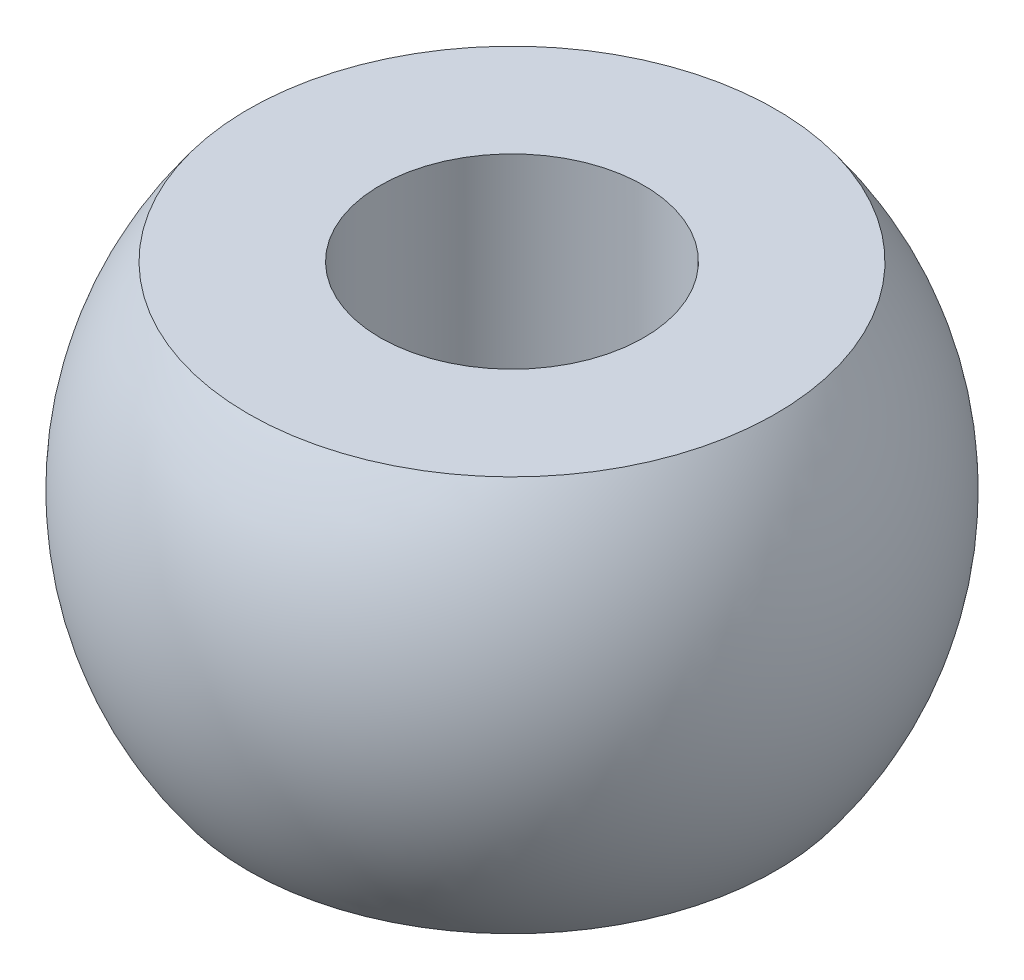
ISO-10303-21;
HEADER;
FILE_DESCRIPTION(('STEP AP214'),'2;1');
FILE_NAME('part.step','',(''),(''),'','','');
FILE_SCHEMA(('AUTOMOTIVE_DESIGN { 1 0 10303 214 1 1 1 1 }'));
ENDSEC;
DATA;
#1=APPLICATION_CONTEXT('core data for automotive mechanical design processes');
#2=APPLICATION_PROTOCOL_DEFINITION('international standard','automotive_design',2000,#1);
#3=PRODUCT_CONTEXT('',#1,'mechanical');
#4=PRODUCT('Part','Part','',(#3));
#5=PRODUCT_RELATED_PRODUCT_CATEGORY('part','',(#4));
#6=PRODUCT_DEFINITION_FORMATION('','',#4);
#7=PRODUCT_DEFINITION_CONTEXT('part definition',#1,'design');
#8=PRODUCT_DEFINITION('design','',#6,#7);
#9=PRODUCT_DEFINITION_SHAPE('','',#8);
#10=(LENGTH_UNIT() NAMED_UNIT(*) SI_UNIT(.MILLI.,.METRE.));
#11=(NAMED_UNIT(*) PLANE_ANGLE_UNIT() SI_UNIT($,.RADIAN.));
#12=(NAMED_UNIT(*) SI_UNIT($,.STERADIAN.) SOLID_ANGLE_UNIT());
#13=UNCERTAINTY_MEASURE_WITH_UNIT(LENGTH_MEASURE(1.E-05),#10,'distance_accuracy_value','');
#14=(GEOMETRIC_REPRESENTATION_CONTEXT(3) GLOBAL_UNCERTAINTY_ASSIGNED_CONTEXT((#13)) GLOBAL_UNIT_ASSIGNED_CONTEXT((#10,
#11,#12)) REPRESENTATION_CONTEXT('',''));
#15=CARTESIAN_POINT('',(0.,0.,0.));
#16=DIRECTION('',(0.,0.,1.));
#17=DIRECTION('',(1.,0.,0.));
#18=AXIS2_PLACEMENT_3D('',#15,#16,#17);
#19=CARTESIAN_POINT('',(0.,0.,0.));
#20=DIRECTION('',(-1.,0.,0.));
#21=DIRECTION('',(0.,0.,-1.));
#22=AXIS2_PLACEMENT_3D('',#19,#20,#21);
#23=SPHERICAL_SURFACE('',#22,5.);
#24=CARTESIAN_POINT('',(0.,0.,0.));
#25=DIRECTION('',(0.,1.,0.));
#26=DIRECTION('',(0.,0.,1.));
#27=AXIS2_PLACEMENT_3D('',#24,#25,#26);
#28=SPHERICAL_SURFACE('',#27,5.);
#29=CARTESIAN_POINT('',(0.,3.,0.));
#30=DIRECTION('',(0.,1.,0.));
#31=DIRECTION('',(0.,0.,1.));
#32=AXIS2_PLACEMENT_3D('',#29,#30,#31);
#33=CIRCLE('',#32,4.);
#34=CARTESIAN_POINT('',(0.,3.,4.));
#35=VERTEX_POINT('',#34);
#36=EDGE_CURVE('E55',#35,#35,#33,.T.);
#37=ORIENTED_EDGE('',*,*,#36,.F.);
#38=EDGE_LOOP('',(#37));
#39=FACE_BOUND('',#38,.T.);
#40=CARTESIAN_POINT('',(0.,-3.,0.));
#41=DIRECTION('',(0.,-1.,0.));
#42=DIRECTION('',(0.,0.,-1.));
#43=AXIS2_PLACEMENT_3D('',#40,#41,#42);
#44=CIRCLE('',#43,4.);
#45=CARTESIAN_POINT('',(0.,-3.,-4.));
#46=VERTEX_POINT('',#45);
#47=EDGE_CURVE('E11',#46,#46,#44,.T.);
#48=ORIENTED_EDGE('',*,*,#47,.F.);
#49=EDGE_LOOP('',(#48));
#50=FACE_BOUND('',#49,.T.);
#51=ADVANCED_FACE('F40',(#39,#50),#28,.T.);
#52=CARTESIAN_POINT('',(0.,-5.,0.));
#53=DIRECTION('',(0.,1.,0.));
#54=DIRECTION('',(0.,0.,1.));
#55=AXIS2_PLACEMENT_3D('',#52,#53,#54);
#56=CYLINDRICAL_SURFACE('',#55,2.);
#57=CARTESIAN_POINT('',(0.,3.,0.));
#58=DIRECTION('',(0.,1.,0.));
#59=DIRECTION('',(0.,0.,1.));
#60=AXIS2_PLACEMENT_3D('',#57,#58,#59);
#61=CIRCLE('',#60,2.);
#62=CARTESIAN_POINT('',(0.,3.,2.));
#63=VERTEX_POINT('',#62);
#64=EDGE_CURVE('E58',#63,#63,#61,.F.);
#65=ORIENTED_EDGE('',*,*,#64,.F.);
#66=EDGE_LOOP('',(#65));
#67=FACE_BOUND('',#66,.T.);
#68=CARTESIAN_POINT('',(0.,-3.,0.));
#69=DIRECTION('',(0.,-1.,0.));
#70=DIRECTION('',(0.,0.,-1.));
#71=AXIS2_PLACEMENT_3D('',#68,#69,#70);
#72=CIRCLE('',#71,2.);
#73=CARTESIAN_POINT('',(0.,-3.,-2.));
#74=VERTEX_POINT('',#73);
#75=EDGE_CURVE('E43',#74,#74,#72,.F.);
#76=ORIENTED_EDGE('',*,*,#75,.F.);
#77=EDGE_LOOP('',(#76));
#78=FACE_BOUND('',#77,.T.);
#79=ADVANCED_FACE('F65',(#67,#78),#56,.F.);
#80=CARTESIAN_POINT('',(0.,3.,0.));
#81=DIRECTION('',(0.,1.,0.));
#82=DIRECTION('',(0.,0.,1.));
#83=AXIS2_PLACEMENT_3D('',#80,#81,#82);
#84=PLANE('',#83);
#85=ORIENTED_EDGE('',*,*,#64,.T.);
#86=EDGE_LOOP('',(#85));
#87=FACE_BOUND('',#86,.T.);
#88=ORIENTED_EDGE('',*,*,#36,.T.);
#89=EDGE_LOOP('',(#88));
#90=FACE_BOUND('',#89,.T.);
#91=ADVANCED_FACE('F62',(#87,#90),#84,.T.);
#92=CARTESIAN_POINT('',(0.,-3.,0.));
#93=DIRECTION('',(0.,-1.,0.));
#94=DIRECTION('',(0.,0.,1.));
#95=AXIS2_PLACEMENT_3D('',#92,#93,#94);
#96=PLANE('',#95);
#97=ORIENTED_EDGE('',*,*,#75,.T.);
#98=EDGE_LOOP('',(#97));
#99=FACE_BOUND('',#98,.T.);
#100=ORIENTED_EDGE('',*,*,#47,.T.);
#101=EDGE_LOOP('',(#100));
#102=FACE_BOUND('',#101,.T.);
#103=ADVANCED_FACE('F70',(#99,#102),#96,.T.);
#104=CLOSED_SHELL('',(#51,#79,#91,#103));
#105=MANIFOLD_SOLID_BREP('B2',#104);
#106=ADVANCED_BREP_SHAPE_REPRESENTATION('',(#18,#105),#14);
#107=SHAPE_DEFINITION_REPRESENTATION(#9,#106);
ENDSEC;
END-ISO-10303-21;
